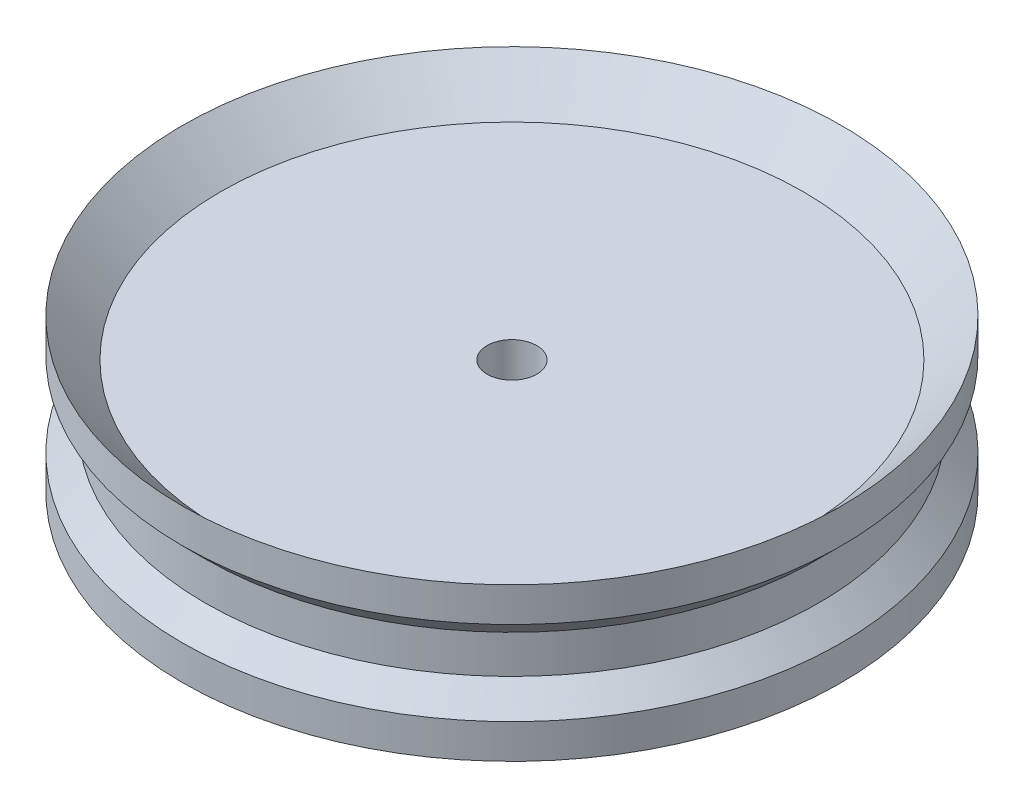
ISO-10303-21;
HEADER;
FILE_DESCRIPTION(('STEP AP214'),'2;1');
FILE_NAME('part.step','',(''),(''),'','','');
FILE_SCHEMA(('AUTOMOTIVE_DESIGN { 1 0 10303 214 1 1 1 1 }'));
ENDSEC;
DATA;
#1=APPLICATION_CONTEXT('core data for automotive mechanical design processes');
#2=APPLICATION_PROTOCOL_DEFINITION('international standard','automotive_design',2000,#1);
#3=PRODUCT_CONTEXT('',#1,'mechanical');
#4=PRODUCT('Part','Part','',(#3));
#5=PRODUCT_RELATED_PRODUCT_CATEGORY('part','',(#4));
#6=PRODUCT_DEFINITION_FORMATION('','',#4);
#7=PRODUCT_DEFINITION_CONTEXT('part definition',#1,'design');
#8=PRODUCT_DEFINITION('design','',#6,#7);
#9=PRODUCT_DEFINITION_SHAPE('','',#8);
#10=(LENGTH_UNIT() NAMED_UNIT(*) SI_UNIT(.MILLI.,.METRE.));
#11=(NAMED_UNIT(*) PLANE_ANGLE_UNIT() SI_UNIT($,.RADIAN.));
#12=(NAMED_UNIT(*) SI_UNIT($,.STERADIAN.) SOLID_ANGLE_UNIT());
#13=UNCERTAINTY_MEASURE_WITH_UNIT(LENGTH_MEASURE(1.E-05),#10,'distance_accuracy_value','');
#14=(GEOMETRIC_REPRESENTATION_CONTEXT(3) GLOBAL_UNCERTAINTY_ASSIGNED_CONTEXT((#13)) GLOBAL_UNIT_ASSIGNED_CONTEXT((#10,
#11,#12)) REPRESENTATION_CONTEXT('',''));
#15=CARTESIAN_POINT('',(0.,0.,0.));
#16=DIRECTION('',(0.,0.,1.));
#17=DIRECTION('',(1.,0.,0.));
#18=AXIS2_PLACEMENT_3D('',#15,#16,#17);
#19=CARTESIAN_POINT('',(0.,5.,0.));
#20=DIRECTION('',(0.,1.,0.));
#21=DIRECTION('',(0.,0.,1.));
#22=AXIS2_PLACEMENT_3D('',#19,#20,#21);
#23=CONICAL_SURFACE('',#22,38.1,0.785398163397448);
#24=DIRECTION('',(0.,0.707106781186547,0.707106781186548));
#25=VECTOR('',#24,1.);
#26=CARTESIAN_POINT('',(0.,5.,38.1));
#27=LINE('',#26,#25);
#28=CARTESIAN_POINT('',(0.,5.,38.1));
#29=VERTEX_POINT('',#28);
#30=CARTESIAN_POINT('',(0.,10.,43.1));
#31=VERTEX_POINT('',#30);
#32=EDGE_CURVE('E92',#29,#31,#27,.T.);
#33=ORIENTED_EDGE('',*,*,#32,.F.);
#34=CARTESIAN_POINT('',(0.,5.,0.));
#35=DIRECTION('',(0.,1.,0.));
#36=DIRECTION('',(0.,0.,1.));
#37=AXIS2_PLACEMENT_3D('',#34,#35,#36);
#38=CIRCLE('',#37,38.1);
#39=EDGE_CURVE('E11',#29,#29,#38,.T.);
#40=ORIENTED_EDGE('',*,*,#39,.F.);
#41=ORIENTED_EDGE('',*,*,#32,.T.);
#42=CARTESIAN_POINT('',(0.,10.,0.));
#43=DIRECTION('',(0.,1.,0.));
#44=DIRECTION('',(0.,0.,1.));
#45=AXIS2_PLACEMENT_3D('',#42,#43,#44);
#46=CIRCLE('',#45,43.1);
#47=EDGE_CURVE('E90',#31,#31,#46,.T.);
#48=ORIENTED_EDGE('',*,*,#47,.T.);
#49=EDGE_LOOP('',(#33,#40,#41,#48));
#50=FACE_BOUND('',#49,.T.);
#51=ADVANCED_FACE('F43',(#50),#23,.F.);
#52=CARTESIAN_POINT('',(0.,5.,38.1));
#53=DIRECTION('',(0.,1.,0.));
#54=DIRECTION('',(0.,0.,1.));
#55=AXIS2_PLACEMENT_3D('',#52,#53,#54);
#56=PLANE('',#55);
#57=CARTESIAN_POINT('',(0.,5.,0.));
#58=DIRECTION('',(0.,1.,0.));
#59=DIRECTION('',(0.,0.,1.));
#60=AXIS2_PLACEMENT_3D('',#57,#58,#59);
#61=CIRCLE('',#60,3.25);
#62=CARTESIAN_POINT('',(0.,5.,3.25));
#63=VERTEX_POINT('',#62);
#64=EDGE_CURVE('E58',#63,#63,#61,.T.);
#65=ORIENTED_EDGE('',*,*,#64,.F.);
#66=EDGE_LOOP('',(#65));
#67=FACE_BOUND('',#66,.T.);
#68=ORIENTED_EDGE('',*,*,#39,.T.);
#69=EDGE_LOOP('',(#68));
#70=FACE_BOUND('',#69,.T.);
#71=ADVANCED_FACE('F147',(#67,#70),#56,.T.);
#72=CARTESIAN_POINT('',(0.,-5.,0.));
#73=DIRECTION('',(0.,-1.,0.));
#74=DIRECTION('',(0.,0.,-1.));
#75=AXIS2_PLACEMENT_3D('',#72,#73,#74);
#76=PLANE('',#75);
#77=CARTESIAN_POINT('',(0.,-5.,0.));
#78=DIRECTION('',(0.,-1.,0.));
#79=DIRECTION('',(0.,0.,-1.));
#80=AXIS2_PLACEMENT_3D('',#77,#78,#79);
#81=CIRCLE('',#80,3.25);
#82=CARTESIAN_POINT('',(0.,-5.,3.25));
#83=VERTEX_POINT('',#82);
#84=EDGE_CURVE('E46',#83,#83,#81,.T.);
#85=ORIENTED_EDGE('',*,*,#84,.F.);
#86=EDGE_LOOP('',(#85));
#87=FACE_BOUND('',#86,.T.);
#88=CARTESIAN_POINT('',(0.,-5.,0.));
#89=DIRECTION('',(0.,1.,0.));
#90=DIRECTION('',(0.,0.,1.));
#91=AXIS2_PLACEMENT_3D('',#88,#89,#90);
#92=CIRCLE('',#91,38.1);
#93=CARTESIAN_POINT('',(0.,-5.,38.1));
#94=VERTEX_POINT('',#93);
#95=EDGE_CURVE('E52',#94,#94,#92,.T.);
#96=ORIENTED_EDGE('',*,*,#95,.F.);
#97=EDGE_LOOP('',(#96));
#98=FACE_BOUND('',#97,.T.);
#99=ADVANCED_FACE('F176',(#87,#98),#76,.T.);
#100=CARTESIAN_POINT('',(0.,-10.,0.));
#101=DIRECTION('',(0.,-1.,0.));
#102=DIRECTION('',(0.,0.,-1.));
#103=AXIS2_PLACEMENT_3D('',#100,#101,#102);
#104=CONICAL_SURFACE('',#103,43.1,0.785398163397448);
#105=DIRECTION('',(0.,0.707106781186548,-0.707106781186547));
#106=VECTOR('',#105,1.);
#107=CARTESIAN_POINT('',(0.,-10.,43.1));
#108=LINE('',#107,#106);
#109=CARTESIAN_POINT('',(0.,-10.,43.1));
#110=VERTEX_POINT('',#109);
#111=EDGE_CURVE('E132',#110,#94,#108,.T.);
#112=ORIENTED_EDGE('',*,*,#111,.F.);
#113=CARTESIAN_POINT('',(0.,-10.,0.));
#114=DIRECTION('',(0.,1.,0.));
#115=DIRECTION('',(0.,0.,1.));
#116=AXIS2_PLACEMENT_3D('',#113,#114,#115);
#117=CIRCLE('',#116,43.1);
#118=EDGE_CURVE('E128',#110,#110,#117,.T.);
#119=ORIENTED_EDGE('',*,*,#118,.F.);
#120=ORIENTED_EDGE('',*,*,#111,.T.);
#121=ORIENTED_EDGE('',*,*,#95,.T.);
#122=EDGE_LOOP('',(#112,#119,#120,#121));
#123=FACE_BOUND('',#122,.T.);
#124=ADVANCED_FACE('F172',(#123),#104,.F.);
#125=CARTESIAN_POINT('',(0.,0.,0.));
#126=DIRECTION('',(0.,1.,0.));
#127=DIRECTION('',(0.,0.,1.));
#128=AXIS2_PLACEMENT_3D('',#125,#126,#127);
#129=CYLINDRICAL_SURFACE('',#128,43.1);
#130=DIRECTION('',(0.,-1.,0.));
#131=VECTOR('',#130,1.);
#132=CARTESIAN_POINT('',(0.,-5.5,43.1));
#133=LINE('',#132,#131);
#134=CARTESIAN_POINT('',(0.,-5.5,43.1));
#135=VERTEX_POINT('',#134);
#136=EDGE_CURVE('E125',#135,#110,#133,.T.);
#137=ORIENTED_EDGE('',*,*,#136,.F.);
#138=CARTESIAN_POINT('',(0.,-5.5,0.));
#139=DIRECTION('',(0.,1.,0.));
#140=DIRECTION('',(0.,0.,1.));
#141=AXIS2_PLACEMENT_3D('',#138,#139,#140);
#142=CIRCLE('',#141,43.1);
#143=EDGE_CURVE('E121',#135,#135,#142,.T.);
#144=ORIENTED_EDGE('',*,*,#143,.F.);
#145=ORIENTED_EDGE('',*,*,#136,.T.);
#146=ORIENTED_EDGE('',*,*,#118,.T.);
#147=EDGE_LOOP('',(#137,#144,#145,#146));
#148=FACE_BOUND('',#147,.T.);
#149=ADVANCED_FACE('F168',(#148),#129,.T.);
#150=CARTESIAN_POINT('',(0.,-2.5,0.));
#151=DIRECTION('',(0.,-1.,0.));
#152=DIRECTION('',(0.,0.,-1.));
#153=AXIS2_PLACEMENT_3D('',#150,#151,#152);
#154=CONICAL_SURFACE('',#153,40.1,0.785398163397449);
#155=DIRECTION('',(0.,-0.707106781186547,0.707106781186548));
#156=VECTOR('',#155,1.);
#157=CARTESIAN_POINT('',(0.,-2.5,40.1));
#158=LINE('',#157,#156);
#159=CARTESIAN_POINT('',(0.,-2.5,40.1));
#160=VERTEX_POINT('',#159);
#161=EDGE_CURVE('E118',#160,#135,#158,.T.);
#162=ORIENTED_EDGE('',*,*,#161,.F.);
#163=CARTESIAN_POINT('',(0.,-2.5,0.));
#164=DIRECTION('',(0.,1.,0.));
#165=DIRECTION('',(0.,0.,1.));
#166=AXIS2_PLACEMENT_3D('',#163,#164,#165);
#167=CIRCLE('',#166,40.1);
#168=EDGE_CURVE('E114',#160,#160,#167,.T.);
#169=ORIENTED_EDGE('',*,*,#168,.F.);
#170=ORIENTED_EDGE('',*,*,#161,.T.);
#171=ORIENTED_EDGE('',*,*,#143,.T.);
#172=EDGE_LOOP('',(#162,#169,#170,#171));
#173=FACE_BOUND('',#172,.T.);
#174=ADVANCED_FACE('F164',(#173),#154,.T.);
#175=CARTESIAN_POINT('',(0.,0.,0.));
#176=DIRECTION('',(0.,1.,0.));
#177=DIRECTION('',(0.,0.,1.));
#178=AXIS2_PLACEMENT_3D('',#175,#176,#177);
#179=CYLINDRICAL_SURFACE('',#178,40.1);
#180=DIRECTION('',(0.,-1.,0.));
#181=VECTOR('',#180,1.);
#182=CARTESIAN_POINT('',(0.,2.5,40.1));
#183=LINE('',#182,#181);
#184=CARTESIAN_POINT('',(0.,2.5,40.1));
#185=VERTEX_POINT('',#184);
#186=EDGE_CURVE('E110',#185,#160,#183,.T.);
#187=ORIENTED_EDGE('',*,*,#186,.F.);
#188=CARTESIAN_POINT('',(0.,2.5,0.));
#189=DIRECTION('',(0.,1.,0.));
#190=DIRECTION('',(0.,0.,1.));
#191=AXIS2_PLACEMENT_3D('',#188,#189,#190);
#192=CIRCLE('',#191,40.1);
#193=EDGE_CURVE('E101',#185,#185,#192,.T.);
#194=ORIENTED_EDGE('',*,*,#193,.F.);
#195=ORIENTED_EDGE('',*,*,#186,.T.);
#196=ORIENTED_EDGE('',*,*,#168,.T.);
#197=EDGE_LOOP('',(#187,#194,#195,#196));
#198=FACE_BOUND('',#197,.T.);
#199=ADVANCED_FACE('F160',(#198),#179,.T.);
#200=CARTESIAN_POINT('',(0.,5.5,0.));
#201=DIRECTION('',(0.,1.,0.));
#202=DIRECTION('',(0.,0.,1.));
#203=AXIS2_PLACEMENT_3D('',#200,#201,#202);
#204=CONICAL_SURFACE('',#203,43.1,0.785398163397449);
#205=DIRECTION('',(0.,-0.707106781186547,-0.707106781186548));
#206=VECTOR('',#205,1.);
#207=CARTESIAN_POINT('',(0.,5.5,43.1));
#208=LINE('',#207,#206);
#209=CARTESIAN_POINT('',(0.,5.5,43.1));
#210=VERTEX_POINT('',#209);
#211=EDGE_CURVE('E106',#210,#185,#208,.T.);
#212=ORIENTED_EDGE('',*,*,#211,.F.);
#213=CARTESIAN_POINT('',(0.,5.5,0.));
#214=DIRECTION('',(0.,1.,0.));
#215=DIRECTION('',(0.,0.,1.));
#216=AXIS2_PLACEMENT_3D('',#213,#214,#215);
#217=CIRCLE('',#216,43.1);
#218=EDGE_CURVE('E97',#210,#210,#217,.T.);
#219=ORIENTED_EDGE('',*,*,#218,.F.);
#220=ORIENTED_EDGE('',*,*,#211,.T.);
#221=ORIENTED_EDGE('',*,*,#193,.T.);
#222=EDGE_LOOP('',(#212,#219,#220,#221));
#223=FACE_BOUND('',#222,.T.);
#224=ADVANCED_FACE('F156',(#223),#204,.T.);
#225=CARTESIAN_POINT('',(0.,0.,0.));
#226=DIRECTION('',(0.,1.,0.));
#227=DIRECTION('',(0.,0.,1.));
#228=AXIS2_PLACEMENT_3D('',#225,#226,#227);
#229=CYLINDRICAL_SURFACE('',#228,43.1);
#230=DIRECTION('',(0.,-1.,0.));
#231=VECTOR('',#230,1.);
#232=CARTESIAN_POINT('',(0.,10.,43.1));
#233=LINE('',#232,#231);
#234=EDGE_CURVE('E111',#31,#210,#233,.T.);
#235=ORIENTED_EDGE('',*,*,#234,.F.);
#236=ORIENTED_EDGE('',*,*,#47,.F.);
#237=ORIENTED_EDGE('',*,*,#234,.T.);
#238=ORIENTED_EDGE('',*,*,#218,.T.);
#239=EDGE_LOOP('',(#235,#236,#237,#238));
#240=FACE_BOUND('',#239,.T.);
#241=ADVANCED_FACE('F152',(#240),#229,.T.);
#242=CARTESIAN_POINT('',(0.,10.,0.));
#243=DIRECTION('',(0.,-1.,0.));
#244=DIRECTION('',(0.,0.,-1.));
#245=AXIS2_PLACEMENT_3D('',#242,#243,#244);
#246=CYLINDRICAL_SURFACE('',#245,3.25);
#247=ORIENTED_EDGE('',*,*,#64,.T.);
#248=EDGE_LOOP('',(#247));
#249=FACE_BOUND('',#248,.T.);
#250=ORIENTED_EDGE('',*,*,#84,.T.);
#251=EDGE_LOOP('',(#250));
#252=FACE_BOUND('',#251,.T.);
#253=ADVANCED_FACE('F209',(#249,#252),#246,.F.);
#254=CLOSED_SHELL('',(#51,#71,#99,#124,#149,#174,#199,#224,#241,#253));
#255=MANIFOLD_SOLID_BREP('B2',#254);
#256=ADVANCED_BREP_SHAPE_REPRESENTATION('',(#18,#255),#14);
#257=SHAPE_DEFINITION_REPRESENTATION(#9,#256);
ENDSEC;
END-ISO-10303-21;
